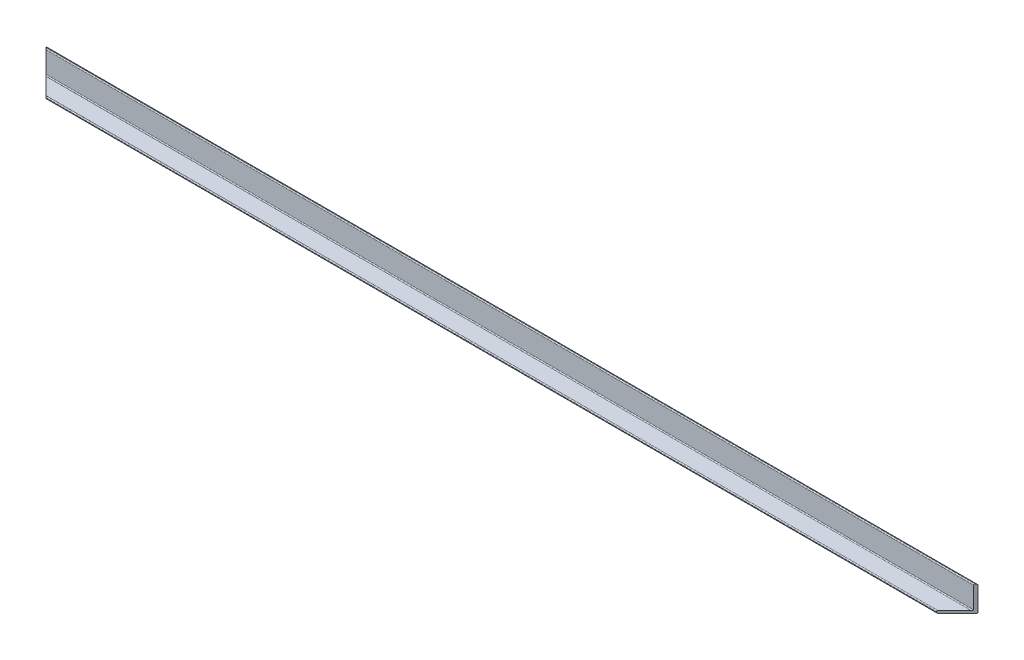
ISO-10303-21;
HEADER;
FILE_DESCRIPTION(('STEP AP214'),'2;1');
FILE_NAME('part.step','',(''),(''),'','','');
FILE_SCHEMA(('AUTOMOTIVE_DESIGN { 1 0 10303 214 1 1 1 1 }'));
ENDSEC;
DATA;
#1=APPLICATION_CONTEXT('core data for automotive mechanical design processes');
#2=APPLICATION_PROTOCOL_DEFINITION('international standard','automotive_design',2000,#1);
#3=PRODUCT_CONTEXT('',#1,'mechanical');
#4=PRODUCT('Part','Part','',(#3));
#5=PRODUCT_RELATED_PRODUCT_CATEGORY('part','',(#4));
#6=PRODUCT_DEFINITION_FORMATION('','',#4);
#7=PRODUCT_DEFINITION_CONTEXT('part definition',#1,'design');
#8=PRODUCT_DEFINITION('design','',#6,#7);
#9=PRODUCT_DEFINITION_SHAPE('','',#8);
#10=(LENGTH_UNIT() NAMED_UNIT(*) SI_UNIT(.MILLI.,.METRE.));
#11=(NAMED_UNIT(*) PLANE_ANGLE_UNIT() SI_UNIT($,.RADIAN.));
#12=(NAMED_UNIT(*) SI_UNIT($,.STERADIAN.) SOLID_ANGLE_UNIT());
#13=UNCERTAINTY_MEASURE_WITH_UNIT(LENGTH_MEASURE(1.E-05),#10,'distance_accuracy_value','');
#14=(GEOMETRIC_REPRESENTATION_CONTEXT(3) GLOBAL_UNCERTAINTY_ASSIGNED_CONTEXT((#13)) GLOBAL_UNIT_ASSIGNED_CONTEXT((#10,
#11,#12)) REPRESENTATION_CONTEXT('',''));
#15=CARTESIAN_POINT('',(0.,0.,0.));
#16=DIRECTION('',(0.,0.,1.));
#17=DIRECTION('',(1.,0.,0.));
#18=AXIS2_PLACEMENT_3D('',#15,#16,#17);
#19=CARTESIAN_POINT('',(-505.,2.5,-11.25));
#20=DIRECTION('',(0.,0.,1.));
#21=DIRECTION('',(1.,0.,0.));
#22=AXIS2_PLACEMENT_3D('',#19,#20,#21);
#23=PLANE('',#22);
#24=DIRECTION('',(0.,-1.,0.));
#25=VECTOR('',#24,1.);
#26=CARTESIAN_POINT('',(-505.,2.5,-11.25));
#27=LINE('',#26,#25);
#28=CARTESIAN_POINT('',(-505.,26.5,-11.25));
#29=VERTEX_POINT('',#28);
#30=CARTESIAN_POINT('',(-505.,1.,-11.25));
#31=VERTEX_POINT('',#30);
#32=EDGE_CURVE('E217',#29,#31,#27,.T.);
#33=ORIENTED_EDGE('',*,*,#32,.F.);
#34=DIRECTION('',(-1.,0.,0.));
#35=VECTOR('',#34,1.);
#36=CARTESIAN_POINT('',(505.,26.5,-11.25));
#37=LINE('',#36,#35);
#38=CARTESIAN_POINT('',(505.,26.5,-11.25));
#39=VERTEX_POINT('',#38);
#40=EDGE_CURVE('E187',#29,#39,#37,.F.);
#41=ORIENTED_EDGE('',*,*,#40,.T.);
#42=DIRECTION('',(0.,-1.,0.));
#43=VECTOR('',#42,1.);
#44=CARTESIAN_POINT('',(505.,2.5,-11.25));
#45=LINE('',#44,#43);
#46=CARTESIAN_POINT('',(505.,1.,-11.25));
#47=VERTEX_POINT('',#46);
#48=EDGE_CURVE('E155',#39,#47,#45,.T.);
#49=ORIENTED_EDGE('',*,*,#48,.T.);
#50=DIRECTION('',(-1.,0.,0.));
#51=VECTOR('',#50,1.);
#52=CARTESIAN_POINT('',(-505.,1.,-11.25));
#53=LINE('',#52,#51);
#54=EDGE_CURVE('E185',#47,#31,#53,.T.);
#55=ORIENTED_EDGE('',*,*,#54,.T.);
#56=EDGE_LOOP('',(#33,#41,#49,#55));
#57=FACE_BOUND('',#56,.T.);
#58=ADVANCED_FACE('F33',(#57),#23,.F.);
#59=CARTESIAN_POINT('',(-505.,2.5,11.25));
#60=DIRECTION('',(0.,0.,-1.));
#61=DIRECTION('',(-1.,0.,0.));
#62=AXIS2_PLACEMENT_3D('',#59,#60,#61);
#63=PLANE('',#62);
#64=DIRECTION('',(0.,-1.,0.));
#65=VECTOR('',#64,1.);
#66=CARTESIAN_POINT('',(-482.5,27.5,11.25));
#67=LINE('',#66,#65);
#68=CARTESIAN_POINT('',(-482.5,1.5,11.25));
#69=VERTEX_POINT('',#68);
#70=CARTESIAN_POINT('',(-482.5,1.,11.25));
#71=VERTEX_POINT('',#70);
#72=EDGE_CURVE('E215',#69,#71,#67,.T.);
#73=ORIENTED_EDGE('',*,*,#72,.T.);
#74=DIRECTION('',(1.,0.,0.));
#75=VECTOR('',#74,1.);
#76=CARTESIAN_POINT('',(-505.,1.,11.25));
#77=LINE('',#76,#75);
#78=CARTESIAN_POINT('',(482.5,1.,11.25));
#79=VERTEX_POINT('',#78);
#80=EDGE_CURVE('E143',#71,#79,#77,.T.);
#81=ORIENTED_EDGE('',*,*,#80,.T.);
#82=DIRECTION('',(0.,-1.,0.));
#83=VECTOR('',#82,1.);
#84=CARTESIAN_POINT('',(482.5,27.5,11.25));
#85=LINE('',#84,#83);
#86=CARTESIAN_POINT('',(482.5,1.5,11.25));
#87=VERTEX_POINT('',#86);
#88=EDGE_CURVE('E126',#87,#79,#85,.T.);
#89=ORIENTED_EDGE('',*,*,#88,.F.);
#90=DIRECTION('',(1.,0.,0.));
#91=VECTOR('',#90,1.);
#92=CARTESIAN_POINT('',(-482.5,1.5,11.25));
#93=LINE('',#92,#91);
#94=EDGE_CURVE('E140',#87,#69,#93,.F.);
#95=ORIENTED_EDGE('',*,*,#94,.T.);
#96=EDGE_LOOP('',(#73,#81,#89,#95));
#97=FACE_BOUND('',#96,.T.);
#98=ADVANCED_FACE('F139',(#97),#63,.F.);
#99=CARTESIAN_POINT('',(0.,2.5,0.));
#100=DIRECTION('',(0.,1.,0.));
#101=DIRECTION('',(0.,0.,1.));
#102=AXIS2_PLACEMENT_3D('',#99,#100,#101);
#103=PLANE('',#102);
#104=DIRECTION('',(-0.707106781186549,0.,-0.707106781186546));
#105=VECTOR('',#104,1.);
#106=CARTESIAN_POINT('',(-246.874999999999,2.5,246.875));
#107=LINE('',#106,#105);
#108=CARTESIAN_POINT('',(-483.5,2.5,10.25));
#109=VERTEX_POINT('',#108);
#110=CARTESIAN_POINT('',(-501.5,2.5,-7.75000000000006));
#111=VERTEX_POINT('',#110);
#112=EDGE_CURVE('E211',#109,#111,#107,.T.);
#113=ORIENTED_EDGE('',*,*,#112,.F.);
#114=DIRECTION('',(1.,0.,0.));
#115=VECTOR('',#114,1.);
#116=CARTESIAN_POINT('',(482.5,2.5,10.25));
#117=LINE('',#116,#115);
#118=CARTESIAN_POINT('',(483.5,2.5,10.25));
#119=VERTEX_POINT('',#118);
#120=EDGE_CURVE('E177',#109,#119,#117,.T.);
#121=ORIENTED_EDGE('',*,*,#120,.T.);
#122=DIRECTION('',(-0.707106781186544,0.,0.707106781186552));
#123=VECTOR('',#122,1.);
#124=CARTESIAN_POINT('',(246.875000000003,2.5,246.875));
#125=LINE('',#124,#123);
#126=CARTESIAN_POINT('',(501.5,2.5,-7.75000000000006));
#127=VERTEX_POINT('',#126);
#128=EDGE_CURVE('E128',#127,#119,#125,.T.);
#129=ORIENTED_EDGE('',*,*,#128,.F.);
#130=DIRECTION('',(1.,0.,0.));
#131=VECTOR('',#130,1.);
#132=CARTESIAN_POINT('',(0.,2.5,-7.75));
#133=LINE('',#132,#131);
#134=EDGE_CURVE('E175',#127,#111,#133,.F.);
#135=ORIENTED_EDGE('',*,*,#134,.T.);
#136=EDGE_LOOP('',(#113,#121,#129,#135));
#137=FACE_BOUND('',#136,.T.);
#138=ADVANCED_FACE('F200',(#137),#103,.T.);
#139=CARTESIAN_POINT('',(0.,0.,0.));
#140=DIRECTION('',(0.,1.,0.));
#141=DIRECTION('',(0.,0.,1.));
#142=AXIS2_PLACEMENT_3D('',#139,#140,#141);
#143=PLANE('',#142);
#144=DIRECTION('',(0.707106781186543,0.,-0.707106781186551));
#145=VECTOR('',#144,1.);
#146=CARTESIAN_POINT('',(482.5,0.,11.25));
#147=LINE('',#146,#145);
#148=CARTESIAN_POINT('',(483.5,0.,10.25));
#149=VERTEX_POINT('',#148);
#150=CARTESIAN_POINT('',(504.,0.,-10.25));
#151=VERTEX_POINT('',#150);
#152=EDGE_CURVE('E145',#149,#151,#147,.T.);
#153=ORIENTED_EDGE('',*,*,#152,.F.);
#154=DIRECTION('',(1.,0.,0.));
#155=VECTOR('',#154,1.);
#156=CARTESIAN_POINT('',(0.,0.,10.25));
#157=LINE('',#156,#155);
#158=CARTESIAN_POINT('',(-483.5,0.,10.25));
#159=VERTEX_POINT('',#158);
#160=EDGE_CURVE('E166',#149,#159,#157,.F.);
#161=ORIENTED_EDGE('',*,*,#160,.T.);
#162=DIRECTION('',(0.707106781186549,0.,0.707106781186546));
#163=VECTOR('',#162,1.);
#164=CARTESIAN_POINT('',(-505.,0.,-11.25));
#165=LINE('',#164,#163);
#166=CARTESIAN_POINT('',(-504.,0.,-10.25));
#167=VERTEX_POINT('',#166);
#168=EDGE_CURVE('E202',#167,#159,#165,.T.);
#169=ORIENTED_EDGE('',*,*,#168,.F.);
#170=DIRECTION('',(-1.,0.,0.));
#171=VECTOR('',#170,1.);
#172=CARTESIAN_POINT('',(0.,0.,-10.25));
#173=LINE('',#172,#171);
#174=EDGE_CURVE('E164',#167,#151,#173,.F.);
#175=ORIENTED_EDGE('',*,*,#174,.T.);
#176=EDGE_LOOP('',(#153,#161,#169,#175));
#177=FACE_BOUND('',#176,.T.);
#178=ADVANCED_FACE('F242',(#177),#143,.F.);
#179=CARTESIAN_POINT('',(-505.,27.5,-8.75));
#180=DIRECTION('',(0.,0.,-1.));
#181=DIRECTION('',(-1.,0.,0.));
#182=AXIS2_PLACEMENT_3D('',#179,#180,#181);
#183=PLANE('',#182);
#184=DIRECTION('',(0.,1.,0.));
#185=VECTOR('',#184,1.);
#186=CARTESIAN_POINT('',(502.5,27.5,-8.75));
#187=LINE('',#186,#185);
#188=CARTESIAN_POINT('',(502.5,3.5,-8.75));
#189=VERTEX_POINT('',#188);
#190=CARTESIAN_POINT('',(502.5,26.5,-8.75));
#191=VERTEX_POINT('',#190);
#192=EDGE_CURVE('E144',#189,#191,#187,.T.);
#193=ORIENTED_EDGE('',*,*,#192,.T.);
#194=DIRECTION('',(1.,0.,0.));
#195=VECTOR('',#194,1.);
#196=CARTESIAN_POINT('',(-502.500000000001,26.5,-8.75));
#197=LINE('',#196,#195);
#198=CARTESIAN_POINT('',(-502.5,26.5,-8.75));
#199=VERTEX_POINT('',#198);
#200=EDGE_CURVE('E192',#191,#199,#197,.F.);
#201=ORIENTED_EDGE('',*,*,#200,.T.);
#202=DIRECTION('',(0.,-1.,0.));
#203=VECTOR('',#202,1.);
#204=CARTESIAN_POINT('',(-502.5,27.5,-8.75));
#205=LINE('',#204,#203);
#206=CARTESIAN_POINT('',(-502.5,3.5,-8.75));
#207=VERTEX_POINT('',#206);
#208=EDGE_CURVE('E209',#199,#207,#205,.T.);
#209=ORIENTED_EDGE('',*,*,#208,.T.);
#210=DIRECTION('',(1.,0.,0.));
#211=VECTOR('',#210,1.);
#212=CARTESIAN_POINT('',(-505.,3.5,-8.75));
#213=LINE('',#212,#211);
#214=EDGE_CURVE('E189',#207,#189,#213,.T.);
#215=ORIENTED_EDGE('',*,*,#214,.T.);
#216=EDGE_LOOP('',(#193,#201,#209,#215));
#217=FACE_BOUND('',#216,.T.);
#218=ADVANCED_FACE('F213',(#217),#183,.F.);
#219=CARTESIAN_POINT('',(0.,27.5,0.));
#220=DIRECTION('',(0.,1.,0.));
#221=DIRECTION('',(0.,0.,1.));
#222=AXIS2_PLACEMENT_3D('',#219,#220,#221);
#223=PLANE('',#222);
#224=DIRECTION('',(-0.707106781186544,0.,0.707106781186552));
#225=VECTOR('',#224,1.);
#226=CARTESIAN_POINT('',(246.875000000003,27.5,246.875));
#227=LINE('',#226,#225);
#228=CARTESIAN_POINT('',(504.,27.5,-10.2500000000001));
#229=VERTEX_POINT('',#228);
#230=CARTESIAN_POINT('',(503.5,27.5,-9.75000000000006));
#231=VERTEX_POINT('',#230);
#232=EDGE_CURVE('E150',#229,#231,#227,.T.);
#233=ORIENTED_EDGE('',*,*,#232,.F.);
#234=DIRECTION('',(-1.,0.,0.));
#235=VECTOR('',#234,1.);
#236=CARTESIAN_POINT('',(-505.,27.5,-10.25));
#237=LINE('',#236,#235);
#238=CARTESIAN_POINT('',(-504.,27.5,-10.25));
#239=VERTEX_POINT('',#238);
#240=EDGE_CURVE('E182',#229,#239,#237,.T.);
#241=ORIENTED_EDGE('',*,*,#240,.T.);
#242=DIRECTION('',(0.707106781186549,0.,0.707106781186546));
#243=VECTOR('',#242,1.);
#244=CARTESIAN_POINT('',(-505.,27.5,-11.25));
#245=LINE('',#244,#243);
#246=CARTESIAN_POINT('',(-503.5,27.5,-9.74999999999998));
#247=VERTEX_POINT('',#246);
#248=EDGE_CURVE('E219',#239,#247,#245,.T.);
#249=ORIENTED_EDGE('',*,*,#248,.T.);
#250=DIRECTION('',(1.,0.,0.));
#251=VECTOR('',#250,1.);
#252=CARTESIAN_POINT('',(502.5,27.5,-9.75));
#253=LINE('',#252,#251);
#254=EDGE_CURVE('E179',#247,#231,#253,.T.);
#255=ORIENTED_EDGE('',*,*,#254,.T.);
#256=EDGE_LOOP('',(#233,#241,#249,#255));
#257=FACE_BOUND('',#256,.T.);
#258=ADVANCED_FACE('F249',(#257),#223,.T.);
#259=CARTESIAN_POINT('',(-505.,27.5,-11.25));
#260=DIRECTION('',(0.707106781186546,0.,-0.707106781186549));
#261=DIRECTION('',(-0.707106781186549,0.,-0.707106781186546));
#262=AXIS2_PLACEMENT_3D('',#259,#260,#261);
#263=PLANE('',#262);
#264=ORIENTED_EDGE('',*,*,#168,.T.);
#265=CARTESIAN_POINT('',(-483.5,1.,10.25));
#266=DIRECTION('',(0.707106781186546,0.,-0.707106781186549));
#267=DIRECTION('',(0.707106781186549,0.,0.707106781186546));
#268=AXIS2_PLACEMENT_3D('',#265,#266,#267);
#269=ELLIPSE('',#268,1.4142135623731,1.);
#270=EDGE_CURVE('E173',#159,#71,#269,.F.);
#271=ORIENTED_EDGE('',*,*,#270,.T.);
#272=ORIENTED_EDGE('',*,*,#72,.F.);
#273=CARTESIAN_POINT('',(-483.5,1.5,10.25));
#274=DIRECTION('',(0.707106781186546,0.,-0.707106781186549));
#275=DIRECTION('',(-0.707106781186549,0.,-0.707106781186546));
#276=AXIS2_PLACEMENT_3D('',#273,#274,#275);
#277=ELLIPSE('',#276,1.4142135623731,1.);
#278=EDGE_CURVE('E149',#69,#109,#277,.F.);
#279=ORIENTED_EDGE('',*,*,#278,.T.);
#280=ORIENTED_EDGE('',*,*,#112,.T.);
#281=CARTESIAN_POINT('',(-501.5,3.5,-7.75));
#282=DIRECTION('',(0.707106781186546,0.,-0.707106781186549));
#283=DIRECTION('',(0.707106781186549,0.,0.707106781186546));
#284=AXIS2_PLACEMENT_3D('',#281,#282,#283);
#285=ELLIPSE('',#284,1.4142135623731,1.);
#286=EDGE_CURVE('E11',#111,#207,#285,.T.);
#287=ORIENTED_EDGE('',*,*,#286,.T.);
#288=ORIENTED_EDGE('',*,*,#208,.F.);
#289=CARTESIAN_POINT('',(-503.5,26.5,-9.75));
#290=DIRECTION('',(0.707106781186546,0.,-0.707106781186549));
#291=DIRECTION('',(-0.707106781186549,0.,-0.707106781186546));
#292=AXIS2_PLACEMENT_3D('',#289,#290,#291);
#293=ELLIPSE('',#292,1.4142135623731,1.);
#294=EDGE_CURVE('E169',#199,#247,#293,.F.);
#295=ORIENTED_EDGE('',*,*,#294,.T.);
#296=ORIENTED_EDGE('',*,*,#248,.F.);
#297=CARTESIAN_POINT('',(-504.,26.5,-10.25));
#298=DIRECTION('',(0.707106781186546,0.,-0.707106781186549));
#299=DIRECTION('',(0.707106781186549,0.,0.707106781186546));
#300=AXIS2_PLACEMENT_3D('',#297,#298,#299);
#301=ELLIPSE('',#300,1.4142135623731,1.);
#302=EDGE_CURVE('E56',#239,#29,#301,.F.);
#303=ORIENTED_EDGE('',*,*,#302,.T.);
#304=ORIENTED_EDGE('',*,*,#32,.T.);
#305=CARTESIAN_POINT('',(-504.,1.,-10.25));
#306=DIRECTION('',(0.707106781186546,0.,-0.707106781186549));
#307=DIRECTION('',(-0.707106781186549,0.,-0.707106781186546));
#308=AXIS2_PLACEMENT_3D('',#305,#306,#307);
#309=ELLIPSE('',#308,1.4142135623731,1.);
#310=EDGE_CURVE('E48',#31,#167,#309,.F.);
#311=ORIENTED_EDGE('',*,*,#310,.T.);
#312=EDGE_LOOP('',(#264,#271,#272,#279,#280,#287,#288,#295,#296,#303,#304,#311));
#313=FACE_BOUND('',#312,.T.);
#314=ADVANCED_FACE('F208',(#313),#263,.F.);
#315=CARTESIAN_POINT('',(482.5,27.5,11.25));
#316=DIRECTION('',(-0.707106781186552,0.,-0.707106781186544));
#317=DIRECTION('',(-0.707106781186544,0.,0.707106781186552));
#318=AXIS2_PLACEMENT_3D('',#315,#316,#317);
#319=PLANE('',#318);
#320=ORIENTED_EDGE('',*,*,#88,.T.);
#321=CARTESIAN_POINT('',(483.5,1.,10.25));
#322=DIRECTION('',(-0.707106781186552,0.,-0.707106781186544));
#323=DIRECTION('',(0.707106781186544,0.,-0.707106781186552));
#324=AXIS2_PLACEMENT_3D('',#321,#322,#323);
#325=ELLIPSE('',#324,1.41421356237309,1.);
#326=EDGE_CURVE('E133',#79,#149,#325,.F.);
#327=ORIENTED_EDGE('',*,*,#326,.T.);
#328=ORIENTED_EDGE('',*,*,#152,.T.);
#329=CARTESIAN_POINT('',(504.,1.,-10.25));
#330=DIRECTION('',(-0.707106781186552,0.,-0.707106781186544));
#331=DIRECTION('',(-0.707106781186544,0.,0.707106781186552));
#332=AXIS2_PLACEMENT_3D('',#329,#330,#331);
#333=ELLIPSE('',#332,1.41421356237309,1.);
#334=EDGE_CURVE('E152',#151,#47,#333,.F.);
#335=ORIENTED_EDGE('',*,*,#334,.T.);
#336=ORIENTED_EDGE('',*,*,#48,.F.);
#337=CARTESIAN_POINT('',(504.,26.5,-10.25));
#338=DIRECTION('',(-0.707106781186552,0.,-0.707106781186544));
#339=DIRECTION('',(0.707106781186544,0.,-0.707106781186552));
#340=AXIS2_PLACEMENT_3D('',#337,#338,#339);
#341=ELLIPSE('',#340,1.41421356237309,1.);
#342=EDGE_CURVE('E134',#39,#229,#341,.F.);
#343=ORIENTED_EDGE('',*,*,#342,.T.);
#344=ORIENTED_EDGE('',*,*,#232,.T.);
#345=CARTESIAN_POINT('',(503.5,26.5,-9.75));
#346=DIRECTION('',(-0.707106781186552,0.,-0.707106781186544));
#347=DIRECTION('',(-0.707106781186544,0.,0.707106781186552));
#348=AXIS2_PLACEMENT_3D('',#345,#346,#347);
#349=ELLIPSE('',#348,1.41421356237309,1.);
#350=EDGE_CURVE('E160',#231,#191,#349,.F.);
#351=ORIENTED_EDGE('',*,*,#350,.T.);
#352=ORIENTED_EDGE('',*,*,#192,.F.);
#353=CARTESIAN_POINT('',(501.5,3.5,-7.75));
#354=DIRECTION('',(-0.707106781186552,0.,-0.707106781186544));
#355=DIRECTION('',(0.707106781186544,0.,-0.707106781186552));
#356=AXIS2_PLACEMENT_3D('',#353,#354,#355);
#357=ELLIPSE('',#356,1.41421356237309,1.);
#358=EDGE_CURVE('E41',#189,#127,#357,.T.);
#359=ORIENTED_EDGE('',*,*,#358,.T.);
#360=ORIENTED_EDGE('',*,*,#128,.T.);
#361=CARTESIAN_POINT('',(483.5,1.5,10.25));
#362=DIRECTION('',(-0.707106781186552,0.,-0.707106781186544));
#363=DIRECTION('',(-0.707106781186544,0.,0.707106781186552));
#364=AXIS2_PLACEMENT_3D('',#361,#362,#363);
#365=ELLIPSE('',#364,1.41421356237309,1.);
#366=EDGE_CURVE('E123',#119,#87,#365,.F.);
#367=ORIENTED_EDGE('',*,*,#366,.T.);
#368=EDGE_LOOP('',(#320,#327,#328,#335,#336,#343,#344,#351,#352,#359,#360,#367));
#369=FACE_BOUND('',#368,.T.);
#370=ADVANCED_FACE('F125',(#369),#319,.F.);
#371=CARTESIAN_POINT('',(-505.,1.,10.25));
#372=DIRECTION('',(1.,0.,0.));
#373=DIRECTION('',(0.,0.,-1.));
#374=AXIS2_PLACEMENT_3D('',#371,#372,#373);
#375=CYLINDRICAL_SURFACE('',#374,1.);
#376=ORIENTED_EDGE('',*,*,#270,.F.);
#377=ORIENTED_EDGE('',*,*,#160,.F.);
#378=ORIENTED_EDGE('',*,*,#326,.F.);
#379=ORIENTED_EDGE('',*,*,#80,.F.);
#380=EDGE_LOOP('',(#376,#377,#378,#379));
#381=FACE_BOUND('',#380,.T.);
#382=ADVANCED_FACE('F241',(#381),#375,.T.);
#383=CARTESIAN_POINT('',(0.,1.5,10.25));
#384=DIRECTION('',(-1.,0.,0.));
#385=DIRECTION('',(0.,0.,1.));
#386=AXIS2_PLACEMENT_3D('',#383,#384,#385);
#387=CYLINDRICAL_SURFACE('',#386,1.);
#388=ORIENTED_EDGE('',*,*,#278,.F.);
#389=ORIENTED_EDGE('',*,*,#94,.F.);
#390=ORIENTED_EDGE('',*,*,#366,.F.);
#391=ORIENTED_EDGE('',*,*,#120,.F.);
#392=EDGE_LOOP('',(#388,#389,#390,#391));
#393=FACE_BOUND('',#392,.T.);
#394=ADVANCED_FACE('F148',(#393),#387,.T.);
#395=CARTESIAN_POINT('',(0.,26.5,-10.25));
#396=DIRECTION('',(1.,0.,0.));
#397=DIRECTION('',(0.,0.,-1.));
#398=AXIS2_PLACEMENT_3D('',#395,#396,#397);
#399=CYLINDRICAL_SURFACE('',#398,1.);
#400=ORIENTED_EDGE('',*,*,#342,.F.);
#401=ORIENTED_EDGE('',*,*,#40,.F.);
#402=ORIENTED_EDGE('',*,*,#302,.F.);
#403=ORIENTED_EDGE('',*,*,#240,.F.);
#404=EDGE_LOOP('',(#400,#401,#402,#403));
#405=FACE_BOUND('',#404,.T.);
#406=ADVANCED_FACE('F263',(#405),#399,.T.);
#407=CARTESIAN_POINT('',(0.,26.5,-9.75));
#408=DIRECTION('',(-1.,0.,0.));
#409=DIRECTION('',(0.,0.,1.));
#410=AXIS2_PLACEMENT_3D('',#407,#408,#409);
#411=CYLINDRICAL_SURFACE('',#410,1.);
#412=ORIENTED_EDGE('',*,*,#294,.F.);
#413=ORIENTED_EDGE('',*,*,#200,.F.);
#414=ORIENTED_EDGE('',*,*,#350,.F.);
#415=ORIENTED_EDGE('',*,*,#254,.F.);
#416=EDGE_LOOP('',(#412,#413,#414,#415));
#417=FACE_BOUND('',#416,.T.);
#418=ADVANCED_FACE('F266',(#417),#411,.T.);
#419=CARTESIAN_POINT('',(-505.,1.,-10.25));
#420=DIRECTION('',(-1.,0.,0.));
#421=DIRECTION('',(0.,0.,1.));
#422=AXIS2_PLACEMENT_3D('',#419,#420,#421);
#423=CYLINDRICAL_SURFACE('',#422,1.);
#424=ORIENTED_EDGE('',*,*,#334,.F.);
#425=ORIENTED_EDGE('',*,*,#174,.F.);
#426=ORIENTED_EDGE('',*,*,#310,.F.);
#427=ORIENTED_EDGE('',*,*,#54,.F.);
#428=EDGE_LOOP('',(#424,#425,#426,#427));
#429=FACE_BOUND('',#428,.T.);
#430=ADVANCED_FACE('F229',(#429),#423,.T.);
#431=CARTESIAN_POINT('',(-505.,3.5,-7.75));
#432=DIRECTION('',(1.,0.,0.));
#433=DIRECTION('',(0.,0.,-1.));
#434=AXIS2_PLACEMENT_3D('',#431,#432,#433);
#435=CYLINDRICAL_SURFACE('',#434,1.);
#436=ORIENTED_EDGE('',*,*,#286,.F.);
#437=ORIENTED_EDGE('',*,*,#134,.F.);
#438=ORIENTED_EDGE('',*,*,#358,.F.);
#439=ORIENTED_EDGE('',*,*,#214,.F.);
#440=EDGE_LOOP('',(#436,#437,#438,#439));
#441=FACE_BOUND('',#440,.T.);
#442=ADVANCED_FACE('F35',(#441),#435,.F.);
#443=CLOSED_SHELL('',(#58,#98,#138,#178,#218,#258,#314,#370,#382,#394,#406,#418,#430,#442));
#444=MANIFOLD_SOLID_BREP('B2',#443);
#445=ADVANCED_BREP_SHAPE_REPRESENTATION('',(#18,#444),#14);
#446=SHAPE_DEFINITION_REPRESENTATION(#9,#445);
ENDSEC;
END-ISO-10303-21;
